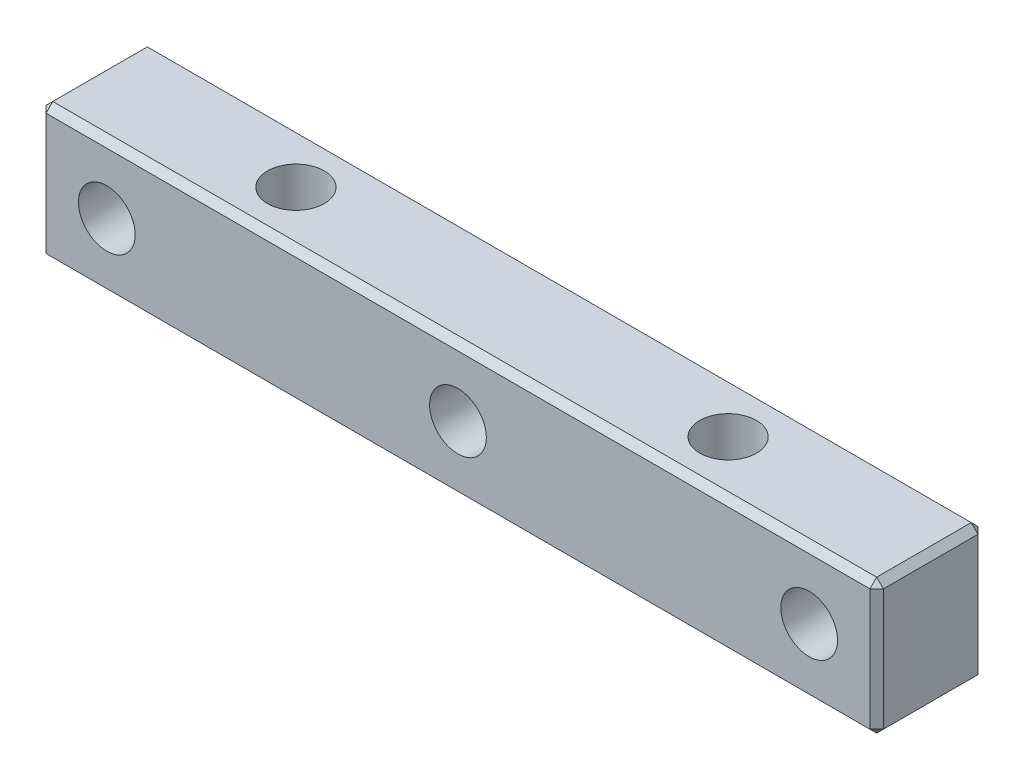
ISO-10303-21;
HEADER;
FILE_DESCRIPTION(('STEP AP214'),'2;1');
FILE_NAME('part.step','',(''),(''),'','','');
FILE_SCHEMA(('AUTOMOTIVE_DESIGN { 1 0 10303 214 1 1 1 1 }'));
ENDSEC;
DATA;
#1=APPLICATION_CONTEXT('core data for automotive mechanical design processes');
#2=APPLICATION_PROTOCOL_DEFINITION('international standard','automotive_design',2000,#1);
#3=PRODUCT_CONTEXT('',#1,'mechanical');
#4=PRODUCT('Part','Part','',(#3));
#5=PRODUCT_RELATED_PRODUCT_CATEGORY('part','',(#4));
#6=PRODUCT_DEFINITION_FORMATION('','',#4);
#7=PRODUCT_DEFINITION_CONTEXT('part definition',#1,'design');
#8=PRODUCT_DEFINITION('design','',#6,#7);
#9=PRODUCT_DEFINITION_SHAPE('','',#8);
#10=(LENGTH_UNIT() NAMED_UNIT(*) SI_UNIT(.MILLI.,.METRE.));
#11=(NAMED_UNIT(*) PLANE_ANGLE_UNIT() SI_UNIT($,.RADIAN.));
#12=(NAMED_UNIT(*) SI_UNIT($,.STERADIAN.) SOLID_ANGLE_UNIT());
#13=UNCERTAINTY_MEASURE_WITH_UNIT(LENGTH_MEASURE(1.E-05),#10,'distance_accuracy_value','');
#14=(GEOMETRIC_REPRESENTATION_CONTEXT(3) GLOBAL_UNCERTAINTY_ASSIGNED_CONTEXT((#13)) GLOBAL_UNIT_ASSIGNED_CONTEXT((#10,
#11,#12)) REPRESENTATION_CONTEXT('',''));
#15=CARTESIAN_POINT('',(0.,0.,0.));
#16=DIRECTION('',(0.,0.,1.));
#17=DIRECTION('',(1.,0.,0.));
#18=AXIS2_PLACEMENT_3D('',#15,#16,#17);
#19=CARTESIAN_POINT('',(0.,0.,4.));
#20=DIRECTION('',(0.,0.,-1.));
#21=DIRECTION('',(-1.,0.,0.));
#22=AXIS2_PLACEMENT_3D('',#19,#20,#21);
#23=PLANE('',#22);
#24=DIRECTION('',(-1.,0.,0.));
#25=VECTOR('',#24,1.);
#26=CARTESIAN_POINT('',(0.,4.5,4.));
#27=LINE('',#26,#25);
#28=CARTESIAN_POINT('',(30.5,4.5,4.));
#29=VERTEX_POINT('',#28);
#30=CARTESIAN_POINT('',(-30.5,4.5,4.));
#31=VERTEX_POINT('',#30);
#32=EDGE_CURVE('E176',#29,#31,#27,.T.);
#33=ORIENTED_EDGE('',*,*,#32,.T.);
#34=DIRECTION('',(0.,-1.,0.));
#35=VECTOR('',#34,1.);
#36=CARTESIAN_POINT('',(-30.5,0.,4.));
#37=LINE('',#36,#35);
#38=CARTESIAN_POINT('',(-30.5,-4.50000000000002,4.));
#39=VERTEX_POINT('',#38);
#40=EDGE_CURVE('E182',#31,#39,#37,.T.);
#41=ORIENTED_EDGE('',*,*,#40,.T.);
#42=DIRECTION('',(1.,0.,0.));
#43=VECTOR('',#42,1.);
#44=CARTESIAN_POINT('',(0.,-4.50000000000001,4.));
#45=LINE('',#44,#43);
#46=CARTESIAN_POINT('',(30.5,-4.50000000000001,4.));
#47=VERTEX_POINT('',#46);
#48=EDGE_CURVE('E180',#39,#47,#45,.T.);
#49=ORIENTED_EDGE('',*,*,#48,.T.);
#50=DIRECTION('',(0.,1.,0.));
#51=VECTOR('',#50,1.);
#52=CARTESIAN_POINT('',(30.5,0.,4.));
#53=LINE('',#52,#51);
#54=EDGE_CURVE('E178',#47,#29,#53,.T.);
#55=ORIENTED_EDGE('',*,*,#54,.T.);
#56=EDGE_LOOP('',(#33,#41,#49,#55));
#57=FACE_BOUND('',#56,.T.);
#58=CARTESIAN_POINT('',(0.,0.,4.));
#59=DIRECTION('',(0.,0.,1.));
#60=DIRECTION('',(1.,0.,0.));
#61=AXIS2_PLACEMENT_3D('',#58,#59,#60);
#62=CIRCLE('',#61,2.1);
#63=CARTESIAN_POINT('',(2.1,0.,4.));
#64=VERTEX_POINT('',#63);
#65=EDGE_CURVE('E281',#64,#64,#62,.T.);
#66=ORIENTED_EDGE('',*,*,#65,.F.);
#67=EDGE_LOOP('',(#66));
#68=FACE_BOUND('',#67,.T.);
#69=CARTESIAN_POINT('',(-26.,0.,4.));
#70=DIRECTION('',(0.,0.,1.));
#71=DIRECTION('',(1.,0.,0.));
#72=AXIS2_PLACEMENT_3D('',#69,#70,#71);
#73=CIRCLE('',#72,2.1);
#74=CARTESIAN_POINT('',(-23.9,0.,4.));
#75=VERTEX_POINT('',#74);
#76=EDGE_CURVE('E287',#75,#75,#73,.T.);
#77=ORIENTED_EDGE('',*,*,#76,.F.);
#78=EDGE_LOOP('',(#77));
#79=FACE_BOUND('',#78,.T.);
#80=CARTESIAN_POINT('',(26.,0.,4.));
#81=DIRECTION('',(0.,0.,1.));
#82=DIRECTION('',(1.,0.,0.));
#83=AXIS2_PLACEMENT_3D('',#80,#81,#82);
#84=CIRCLE('',#83,2.1);
#85=CARTESIAN_POINT('',(28.1,0.,4.));
#86=VERTEX_POINT('',#85);
#87=EDGE_CURVE('E293',#86,#86,#84,.T.);
#88=ORIENTED_EDGE('',*,*,#87,.F.);
#89=EDGE_LOOP('',(#88));
#90=FACE_BOUND('',#89,.T.);
#91=ADVANCED_FACE('F38',(#57,#68,#79,#90),#23,.F.);
#92=CARTESIAN_POINT('',(0.,0.,-4.));
#93=DIRECTION('',(0.,0.,-1.));
#94=DIRECTION('',(-1.,0.,0.));
#95=AXIS2_PLACEMENT_3D('',#92,#93,#94);
#96=PLANE('',#95);
#97=DIRECTION('',(-1.,0.,0.));
#98=VECTOR('',#97,1.);
#99=CARTESIAN_POINT('',(-31.,-4.50000000000001,-4.));
#100=LINE('',#99,#98);
#101=CARTESIAN_POINT('',(30.5,-4.5,-4.));
#102=VERTEX_POINT('',#101);
#103=CARTESIAN_POINT('',(-30.5,-4.50000000000001,-4.));
#104=VERTEX_POINT('',#103);
#105=EDGE_CURVE('E198',#102,#104,#100,.T.);
#106=ORIENTED_EDGE('',*,*,#105,.T.);
#107=DIRECTION('',(0.,1.,0.));
#108=VECTOR('',#107,1.);
#109=CARTESIAN_POINT('',(-30.5,4.99999999999999,-4.));
#110=LINE('',#109,#108);
#111=CARTESIAN_POINT('',(-30.5,4.5,-4.));
#112=VERTEX_POINT('',#111);
#113=EDGE_CURVE('E200',#104,#112,#110,.T.);
#114=ORIENTED_EDGE('',*,*,#113,.T.);
#115=DIRECTION('',(1.,0.,0.));
#116=VECTOR('',#115,1.);
#117=CARTESIAN_POINT('',(31.,4.5,-4.));
#118=LINE('',#117,#116);
#119=CARTESIAN_POINT('',(30.5,4.5,-4.));
#120=VERTEX_POINT('',#119);
#121=EDGE_CURVE('E194',#112,#120,#118,.T.);
#122=ORIENTED_EDGE('',*,*,#121,.T.);
#123=DIRECTION('',(0.,-1.,0.));
#124=VECTOR('',#123,1.);
#125=CARTESIAN_POINT('',(30.5,-5.,-4.));
#126=LINE('',#125,#124);
#127=EDGE_CURVE('E196',#120,#102,#126,.T.);
#128=ORIENTED_EDGE('',*,*,#127,.T.);
#129=EDGE_LOOP('',(#106,#114,#122,#128));
#130=FACE_BOUND('',#129,.T.);
#131=CARTESIAN_POINT('',(0.,0.,-4.));
#132=DIRECTION('',(0.,0.,1.));
#133=DIRECTION('',(1.,0.,0.));
#134=AXIS2_PLACEMENT_3D('',#131,#132,#133);
#135=CIRCLE('',#134,2.1);
#136=CARTESIAN_POINT('',(2.1,0.,-4.));
#137=VERTEX_POINT('',#136);
#138=EDGE_CURVE('E284',#137,#137,#135,.T.);
#139=ORIENTED_EDGE('',*,*,#138,.T.);
#140=EDGE_LOOP('',(#139));
#141=FACE_BOUND('',#140,.T.);
#142=CARTESIAN_POINT('',(-26.,0.,-4.));
#143=DIRECTION('',(0.,0.,1.));
#144=DIRECTION('',(1.,0.,0.));
#145=AXIS2_PLACEMENT_3D('',#142,#143,#144);
#146=CIRCLE('',#145,2.1);
#147=CARTESIAN_POINT('',(-23.9,0.,-4.));
#148=VERTEX_POINT('',#147);
#149=EDGE_CURVE('E290',#148,#148,#146,.T.);
#150=ORIENTED_EDGE('',*,*,#149,.T.);
#151=EDGE_LOOP('',(#150));
#152=FACE_BOUND('',#151,.T.);
#153=CARTESIAN_POINT('',(26.,0.,-4.));
#154=DIRECTION('',(0.,0.,1.));
#155=DIRECTION('',(1.,0.,0.));
#156=AXIS2_PLACEMENT_3D('',#153,#154,#155);
#157=CIRCLE('',#156,2.1);
#158=CARTESIAN_POINT('',(28.1,0.,-4.));
#159=VERTEX_POINT('',#158);
#160=EDGE_CURVE('E159',#159,#159,#157,.T.);
#161=ORIENTED_EDGE('',*,*,#160,.T.);
#162=EDGE_LOOP('',(#161));
#163=FACE_BOUND('',#162,.T.);
#164=ADVANCED_FACE('F330',(#130,#141,#152,#163),#96,.T.);
#165=CARTESIAN_POINT('',(-31.,4.99999999999999,4.));
#166=DIRECTION('',(0.,-1.,0.));
#167=DIRECTION('',(0.,0.,-1.));
#168=AXIS2_PLACEMENT_3D('',#165,#166,#167);
#169=PLANE('',#168);
#170=DIRECTION('',(-1.,0.,0.));
#171=VECTOR('',#170,1.);
#172=CARTESIAN_POINT('',(-31.,4.99999999999999,-3.5));
#173=LINE('',#172,#171);
#174=CARTESIAN_POINT('',(30.5,4.99999999999999,-3.5));
#175=VERTEX_POINT('',#174);
#176=CARTESIAN_POINT('',(-30.5,4.99999999999999,-3.5));
#177=VERTEX_POINT('',#176);
#178=EDGE_CURVE('E173',#175,#177,#173,.T.);
#179=ORIENTED_EDGE('',*,*,#178,.T.);
#180=DIRECTION('',(0.,0.,1.));
#181=VECTOR('',#180,1.);
#182=CARTESIAN_POINT('',(-30.5,4.99999999999999,4.));
#183=LINE('',#182,#181);
#184=CARTESIAN_POINT('',(-30.5,4.99999999999999,3.5));
#185=VERTEX_POINT('',#184);
#186=EDGE_CURVE('E136',#177,#185,#183,.T.);
#187=ORIENTED_EDGE('',*,*,#186,.T.);
#188=DIRECTION('',(1.,0.,0.));
#189=VECTOR('',#188,1.);
#190=CARTESIAN_POINT('',(-31.,4.99999999999999,3.5));
#191=LINE('',#190,#189);
#192=CARTESIAN_POINT('',(30.5,4.99999999999999,3.5));
#193=VERTEX_POINT('',#192);
#194=EDGE_CURVE('E165',#185,#193,#191,.T.);
#195=ORIENTED_EDGE('',*,*,#194,.T.);
#196=DIRECTION('',(0.,0.,-1.));
#197=VECTOR('',#196,1.);
#198=CARTESIAN_POINT('',(30.5,4.99999999999999,4.));
#199=LINE('',#198,#197);
#200=EDGE_CURVE('E167',#193,#175,#199,.T.);
#201=ORIENTED_EDGE('',*,*,#200,.T.);
#202=EDGE_LOOP('',(#179,#187,#195,#201));
#203=FACE_BOUND('',#202,.T.);
#204=CARTESIAN_POINT('',(16.,4.99999999999999,0.));
#205=DIRECTION('',(0.,1.,0.));
#206=DIRECTION('',(0.,0.,1.));
#207=AXIS2_PLACEMENT_3D('',#204,#205,#206);
#208=CIRCLE('',#207,2.1);
#209=CARTESIAN_POINT('',(16.,4.99999999999999,2.1));
#210=VERTEX_POINT('',#209);
#211=EDGE_CURVE('E262',#210,#210,#208,.T.);
#212=ORIENTED_EDGE('',*,*,#211,.F.);
#213=EDGE_LOOP('',(#212));
#214=FACE_BOUND('',#213,.T.);
#215=CARTESIAN_POINT('',(-16.,4.99999999999999,0.));
#216=DIRECTION('',(0.,1.,0.));
#217=DIRECTION('',(0.,0.,1.));
#218=AXIS2_PLACEMENT_3D('',#215,#216,#217);
#219=CIRCLE('',#218,2.1);
#220=CARTESIAN_POINT('',(-16.,4.99999999999999,2.1));
#221=VERTEX_POINT('',#220);
#222=EDGE_CURVE('E273',#221,#221,#219,.T.);
#223=ORIENTED_EDGE('',*,*,#222,.F.);
#224=EDGE_LOOP('',(#223));
#225=FACE_BOUND('',#224,.T.);
#226=ADVANCED_FACE('F321',(#203,#214,#225),#169,.F.);
#227=CARTESIAN_POINT('',(-31.,4.99999999999999,4.));
#228=DIRECTION('',(1.,0.,0.));
#229=DIRECTION('',(0.,0.,-1.));
#230=AXIS2_PLACEMENT_3D('',#227,#228,#229);
#231=PLANE('',#230);
#232=DIRECTION('',(0.,1.,0.));
#233=VECTOR('',#232,1.);
#234=CARTESIAN_POINT('',(-31.,4.99999999999999,3.5));
#235=LINE('',#234,#233);
#236=CARTESIAN_POINT('',(-31.,-4.50000000000001,3.5));
#237=VERTEX_POINT('',#236);
#238=CARTESIAN_POINT('',(-31.,4.5,3.5));
#239=VERTEX_POINT('',#238);
#240=EDGE_CURVE('E163',#237,#239,#235,.T.);
#241=ORIENTED_EDGE('',*,*,#240,.T.);
#242=DIRECTION('',(0.,0.,-1.));
#243=VECTOR('',#242,1.);
#244=CARTESIAN_POINT('',(-31.,4.5,4.));
#245=LINE('',#244,#243);
#246=CARTESIAN_POINT('',(-31.,4.5,-3.50000000000001));
#247=VERTEX_POINT('',#246);
#248=EDGE_CURVE('E134',#239,#247,#245,.T.);
#249=ORIENTED_EDGE('',*,*,#248,.T.);
#250=DIRECTION('',(0.,-1.,0.));
#251=VECTOR('',#250,1.);
#252=CARTESIAN_POINT('',(-31.,-5.00000000000001,-3.50000000000001));
#253=LINE('',#252,#251);
#254=CARTESIAN_POINT('',(-31.,-4.50000000000001,-3.50000000000001));
#255=VERTEX_POINT('',#254);
#256=EDGE_CURVE('E152',#247,#255,#253,.T.);
#257=ORIENTED_EDGE('',*,*,#256,.T.);
#258=DIRECTION('',(0.,0.,1.));
#259=VECTOR('',#258,1.);
#260=CARTESIAN_POINT('',(-31.,-4.50000000000001,4.));
#261=LINE('',#260,#259);
#262=EDGE_CURVE('E158',#255,#237,#261,.T.);
#263=ORIENTED_EDGE('',*,*,#262,.T.);
#264=EDGE_LOOP('',(#241,#249,#257,#263));
#265=FACE_BOUND('',#264,.T.);
#266=ADVANCED_FACE('F161',(#265),#231,.F.);
#267=CARTESIAN_POINT('',(31.,-5.,4.));
#268=DIRECTION('',(0.,1.,0.));
#269=DIRECTION('',(-1.,0.,0.));
#270=AXIS2_PLACEMENT_3D('',#267,#268,#269);
#271=PLANE('',#270);
#272=DIRECTION('',(0.,0.,1.));
#273=VECTOR('',#272,1.);
#274=CARTESIAN_POINT('',(30.5,-5.,4.));
#275=LINE('',#274,#273);
#276=CARTESIAN_POINT('',(30.5,-5.,-3.50000000000001));
#277=VERTEX_POINT('',#276);
#278=CARTESIAN_POINT('',(30.5,-5.,3.5));
#279=VERTEX_POINT('',#278);
#280=EDGE_CURVE('E187',#277,#279,#275,.T.);
#281=ORIENTED_EDGE('',*,*,#280,.T.);
#282=DIRECTION('',(-1.,0.,0.));
#283=VECTOR('',#282,1.);
#284=CARTESIAN_POINT('',(31.,-5.,3.5));
#285=LINE('',#284,#283);
#286=CARTESIAN_POINT('',(-30.5,-5.00000000000001,3.5));
#287=VERTEX_POINT('',#286);
#288=EDGE_CURVE('E192',#279,#287,#285,.T.);
#289=ORIENTED_EDGE('',*,*,#288,.T.);
#290=DIRECTION('',(0.,0.,-1.));
#291=VECTOR('',#290,1.);
#292=CARTESIAN_POINT('',(-30.5,-5.00000000000001,4.));
#293=LINE('',#292,#291);
#294=CARTESIAN_POINT('',(-30.5,-5.00000000000001,-3.50000000000001));
#295=VERTEX_POINT('',#294);
#296=EDGE_CURVE('E189',#287,#295,#293,.T.);
#297=ORIENTED_EDGE('',*,*,#296,.T.);
#298=DIRECTION('',(1.,0.,0.));
#299=VECTOR('',#298,1.);
#300=CARTESIAN_POINT('',(31.,-5.,-3.50000000000001));
#301=LINE('',#300,#299);
#302=EDGE_CURVE('E185',#295,#277,#301,.T.);
#303=ORIENTED_EDGE('',*,*,#302,.T.);
#304=EDGE_LOOP('',(#281,#289,#297,#303));
#305=FACE_BOUND('',#304,.T.);
#306=CARTESIAN_POINT('',(16.,-5.00000000000001,0.));
#307=DIRECTION('',(0.,1.,0.));
#308=DIRECTION('',(0.,0.,1.));
#309=AXIS2_PLACEMENT_3D('',#306,#307,#308);
#310=CIRCLE('',#309,2.1);
#311=CARTESIAN_POINT('',(16.,-5.00000000000001,2.1));
#312=VERTEX_POINT('',#311);
#313=EDGE_CURVE('E268',#312,#312,#310,.T.);
#314=ORIENTED_EDGE('',*,*,#313,.T.);
#315=EDGE_LOOP('',(#314));
#316=FACE_BOUND('',#315,.T.);
#317=CARTESIAN_POINT('',(-16.,-5.00000000000001,0.));
#318=DIRECTION('',(0.,1.,0.));
#319=DIRECTION('',(0.,0.,1.));
#320=AXIS2_PLACEMENT_3D('',#317,#318,#319);
#321=CIRCLE('',#320,2.1);
#322=CARTESIAN_POINT('',(-16.,-5.00000000000001,2.1));
#323=VERTEX_POINT('',#322);
#324=EDGE_CURVE('E278',#323,#323,#321,.T.);
#325=ORIENTED_EDGE('',*,*,#324,.T.);
#326=EDGE_LOOP('',(#325));
#327=FACE_BOUND('',#326,.T.);
#328=ADVANCED_FACE('F365',(#305,#316,#327),#271,.F.);
#329=CARTESIAN_POINT('',(31.,4.99999999999999,4.));
#330=DIRECTION('',(-1.,0.,0.));
#331=DIRECTION('',(0.,0.,1.));
#332=AXIS2_PLACEMENT_3D('',#329,#330,#331);
#333=PLANE('',#332);
#334=DIRECTION('',(0.,-1.,0.));
#335=VECTOR('',#334,1.);
#336=CARTESIAN_POINT('',(31.,4.99999999999999,3.5));
#337=LINE('',#336,#335);
#338=CARTESIAN_POINT('',(31.,4.5,3.5));
#339=VERTEX_POINT('',#338);
#340=CARTESIAN_POINT('',(31.,-4.50000000000001,3.5));
#341=VERTEX_POINT('',#340);
#342=EDGE_CURVE('E47',#339,#341,#337,.T.);
#343=ORIENTED_EDGE('',*,*,#342,.T.);
#344=DIRECTION('',(0.,0.,-1.));
#345=VECTOR('',#344,1.);
#346=CARTESIAN_POINT('',(31.,-4.50000000000001,4.));
#347=LINE('',#346,#345);
#348=CARTESIAN_POINT('',(31.,-4.50000000000001,-3.50000000000001));
#349=VERTEX_POINT('',#348);
#350=EDGE_CURVE('E11',#341,#349,#347,.T.);
#351=ORIENTED_EDGE('',*,*,#350,.T.);
#352=DIRECTION('',(0.,1.,0.));
#353=VECTOR('',#352,1.);
#354=CARTESIAN_POINT('',(31.,4.99999999999999,-3.50000000000001));
#355=LINE('',#354,#353);
#356=CARTESIAN_POINT('',(31.,4.5,-3.50000000000001));
#357=VERTEX_POINT('',#356);
#358=EDGE_CURVE('E61',#349,#357,#355,.T.);
#359=ORIENTED_EDGE('',*,*,#358,.T.);
#360=DIRECTION('',(0.,0.,1.));
#361=VECTOR('',#360,1.);
#362=CARTESIAN_POINT('',(31.,4.5,4.));
#363=LINE('',#362,#361);
#364=EDGE_CURVE('E203',#357,#339,#363,.T.);
#365=ORIENTED_EDGE('',*,*,#364,.T.);
#366=EDGE_LOOP('',(#343,#351,#359,#365));
#367=FACE_BOUND('',#366,.T.);
#368=ADVANCED_FACE('F362',(#367),#333,.F.);
#369=CARTESIAN_POINT('',(26.,0.,4.));
#370=DIRECTION('',(0.,0.,1.));
#371=DIRECTION('',(1.,0.,0.));
#372=AXIS2_PLACEMENT_3D('',#369,#370,#371);
#373=CYLINDRICAL_SURFACE('',#372,2.1);
#374=ORIENTED_EDGE('',*,*,#160,.F.);
#375=EDGE_LOOP('',(#374));
#376=FACE_BOUND('',#375,.T.);
#377=ORIENTED_EDGE('',*,*,#87,.T.);
#378=EDGE_LOOP('',(#377));
#379=FACE_BOUND('',#378,.T.);
#380=ADVANCED_FACE('F359',(#376,#379),#373,.F.);
#381=CARTESIAN_POINT('',(-26.,0.,4.));
#382=DIRECTION('',(0.,0.,1.));
#383=DIRECTION('',(1.,0.,0.));
#384=AXIS2_PLACEMENT_3D('',#381,#382,#383);
#385=CYLINDRICAL_SURFACE('',#384,2.1);
#386=ORIENTED_EDGE('',*,*,#149,.F.);
#387=EDGE_LOOP('',(#386));
#388=FACE_BOUND('',#387,.T.);
#389=ORIENTED_EDGE('',*,*,#76,.T.);
#390=EDGE_LOOP('',(#389));
#391=FACE_BOUND('',#390,.T.);
#392=ADVANCED_FACE('F550',(#388,#391),#385,.F.);
#393=CARTESIAN_POINT('',(0.,0.,4.));
#394=DIRECTION('',(0.,0.,1.));
#395=DIRECTION('',(1.,0.,0.));
#396=AXIS2_PLACEMENT_3D('',#393,#394,#395);
#397=CYLINDRICAL_SURFACE('',#396,2.1);
#398=ORIENTED_EDGE('',*,*,#138,.F.);
#399=EDGE_LOOP('',(#398));
#400=FACE_BOUND('',#399,.T.);
#401=ORIENTED_EDGE('',*,*,#65,.T.);
#402=EDGE_LOOP('',(#401));
#403=FACE_BOUND('',#402,.T.);
#404=ADVANCED_FACE('F540',(#400,#403),#397,.F.);
#405=CARTESIAN_POINT('',(-16.,4.99999999999999,0.));
#406=DIRECTION('',(0.,1.,0.));
#407=DIRECTION('',(0.,0.,1.));
#408=AXIS2_PLACEMENT_3D('',#405,#406,#407);
#409=CYLINDRICAL_SURFACE('',#408,2.1);
#410=ORIENTED_EDGE('',*,*,#324,.F.);
#411=EDGE_LOOP('',(#410));
#412=FACE_BOUND('',#411,.T.);
#413=ORIENTED_EDGE('',*,*,#222,.T.);
#414=EDGE_LOOP('',(#413));
#415=FACE_BOUND('',#414,.T.);
#416=ADVANCED_FACE('F530',(#412,#415),#409,.F.);
#417=CARTESIAN_POINT('',(16.,4.99999999999999,0.));
#418=DIRECTION('',(0.,1.,0.));
#419=DIRECTION('',(0.,0.,1.));
#420=AXIS2_PLACEMENT_3D('',#417,#418,#419);
#421=CYLINDRICAL_SURFACE('',#420,2.1);
#422=ORIENTED_EDGE('',*,*,#313,.F.);
#423=EDGE_LOOP('',(#422));
#424=FACE_BOUND('',#423,.T.);
#425=ORIENTED_EDGE('',*,*,#211,.T.);
#426=EDGE_LOOP('',(#425));
#427=FACE_BOUND('',#426,.T.);
#428=ADVANCED_FACE('F521',(#424,#427),#421,.F.);
#429=CARTESIAN_POINT('',(31.,-4.50000000000001,4.));
#430=DIRECTION('',(-0.707106781186543,0.707106781186552,0.));
#431=DIRECTION('',(0.,0.,-1.));
#432=AXIS2_PLACEMENT_3D('',#429,#430,#431);
#433=PLANE('',#432);
#434=DIRECTION('',(-0.707106781186552,-0.707106781186543,0.));
#435=VECTOR('',#434,1.);
#436=CARTESIAN_POINT('',(30.5,-5.,3.5));
#437=LINE('',#436,#435);
#438=EDGE_CURVE('E42',#279,#341,#437,.F.);
#439=ORIENTED_EDGE('',*,*,#438,.F.);
#440=ORIENTED_EDGE('',*,*,#280,.F.);
#441=DIRECTION('',(0.707106781186552,0.707106781186543,0.));
#442=VECTOR('',#441,1.);
#443=CARTESIAN_POINT('',(31.,-4.50000000000001,-3.50000000000001));
#444=LINE('',#443,#442);
#445=EDGE_CURVE('E256',#349,#277,#444,.F.);
#446=ORIENTED_EDGE('',*,*,#445,.F.);
#447=ORIENTED_EDGE('',*,*,#350,.F.);
#448=EDGE_LOOP('',(#439,#440,#446,#447));
#449=FACE_BOUND('',#448,.T.);
#450=ADVANCED_FACE('F40',(#449),#433,.F.);
#451=CARTESIAN_POINT('',(30.5,-5.,3.5));
#452=DIRECTION('',(0.577350269189626,-0.577350269189634,0.577350269189617));
#453=DIRECTION('',(0.707106781186552,0.707106781186542,0.));
#454=AXIS2_PLACEMENT_3D('',#451,#452,#453);
#455=PLANE('',#454);
#456=DIRECTION('',(0.,0.707106781186542,0.707106781186553));
#457=VECTOR('',#456,1.);
#458=CARTESIAN_POINT('',(30.5,-5.,3.5));
#459=LINE('',#458,#457);
#460=EDGE_CURVE('E251',#279,#47,#459,.T.);
#461=ORIENTED_EDGE('',*,*,#460,.F.);
#462=ORIENTED_EDGE('',*,*,#438,.T.);
#463=DIRECTION('',(0.707106781186543,0.,-0.707106781186552));
#464=VECTOR('',#463,1.);
#465=CARTESIAN_POINT('',(30.75,-4.50000000000001,3.75));
#466=LINE('',#465,#464);
#467=EDGE_CURVE('E254',#47,#341,#466,.T.);
#468=ORIENTED_EDGE('',*,*,#467,.F.);
#469=EDGE_LOOP('',(#461,#462,#468));
#470=FACE_BOUND('',#469,.T.);
#471=ADVANCED_FACE('F507',(#470),#455,.T.);
#472=CARTESIAN_POINT('',(31.,-4.50000000000001,-3.50000000000001));
#473=DIRECTION('',(0.577350269189618,-0.577350269189626,-0.577350269189633));
#474=DIRECTION('',(0.,0.707106781186552,-0.707106781186543));
#475=AXIS2_PLACEMENT_3D('',#472,#473,#474);
#476=PLANE('',#475);
#477=DIRECTION('',(0.707106781186552,0.,0.707106781186543));
#478=VECTOR('',#477,1.);
#479=CARTESIAN_POINT('',(31.,-4.50000000000001,-3.50000000000001));
#480=LINE('',#479,#478);
#481=EDGE_CURVE('E246',#349,#102,#480,.F.);
#482=ORIENTED_EDGE('',*,*,#481,.F.);
#483=ORIENTED_EDGE('',*,*,#445,.T.);
#484=DIRECTION('',(0.,0.707106781186552,-0.707106781186544));
#485=VECTOR('',#484,1.);
#486=CARTESIAN_POINT('',(30.5,-4.75,-3.75));
#487=LINE('',#486,#485);
#488=EDGE_CURVE('E248',#102,#277,#487,.F.);
#489=ORIENTED_EDGE('',*,*,#488,.F.);
#490=EDGE_LOOP('',(#482,#483,#489));
#491=FACE_BOUND('',#490,.T.);
#492=ADVANCED_FACE('F498',(#491),#476,.T.);
#493=CARTESIAN_POINT('',(30.5,0.,4.));
#494=DIRECTION('',(-0.707106781186552,0.,-0.707106781186543));
#495=DIRECTION('',(0.,1.,0.));
#496=AXIS2_PLACEMENT_3D('',#493,#494,#495);
#497=PLANE('',#496);
#498=ORIENTED_EDGE('',*,*,#467,.T.);
#499=ORIENTED_EDGE('',*,*,#342,.F.);
#500=DIRECTION('',(-0.707106781186543,0.,0.707106781186552));
#501=VECTOR('',#500,1.);
#502=CARTESIAN_POINT('',(30.5,4.5,4.));
#503=LINE('',#502,#501);
#504=EDGE_CURVE('E240',#29,#339,#503,.F.);
#505=ORIENTED_EDGE('',*,*,#504,.F.);
#506=ORIENTED_EDGE('',*,*,#54,.F.);
#507=EDGE_LOOP('',(#498,#499,#505,#506));
#508=FACE_BOUND('',#507,.T.);
#509=ADVANCED_FACE('F489',(#508),#497,.F.);
#510=CARTESIAN_POINT('',(0.,-4.50000000000001,4.));
#511=DIRECTION('',(0.,0.707106781186553,-0.707106781186542));
#512=DIRECTION('',(1.,0.,0.));
#513=AXIS2_PLACEMENT_3D('',#510,#511,#512);
#514=PLANE('',#513);
#515=ORIENTED_EDGE('',*,*,#460,.T.);
#516=ORIENTED_EDGE('',*,*,#48,.F.);
#517=DIRECTION('',(0.,-0.707106781186542,-0.707106781186553));
#518=VECTOR('',#517,1.);
#519=CARTESIAN_POINT('',(-30.5,-4.50000000000002,4.));
#520=LINE('',#519,#518);
#521=EDGE_CURVE('E237',#287,#39,#520,.F.);
#522=ORIENTED_EDGE('',*,*,#521,.F.);
#523=ORIENTED_EDGE('',*,*,#288,.F.);
#524=EDGE_LOOP('',(#515,#516,#522,#523));
#525=FACE_BOUND('',#524,.T.);
#526=ADVANCED_FACE('F481',(#525),#514,.F.);
#527=CARTESIAN_POINT('',(-30.5,-5.00000000000001,4.));
#528=DIRECTION('',(0.707106781186552,0.707106781186543,0.));
#529=DIRECTION('',(0.,0.,-1.));
#530=AXIS2_PLACEMENT_3D('',#527,#528,#529);
#531=PLANE('',#530);
#532=DIRECTION('',(0.707106781186543,-0.707106781186552,0.));
#533=VECTOR('',#532,1.);
#534=CARTESIAN_POINT('',(-30.5,-5.00000000000001,-3.50000000000001));
#535=LINE('',#534,#533);
#536=EDGE_CURVE('E231',#295,#255,#535,.F.);
#537=ORIENTED_EDGE('',*,*,#536,.F.);
#538=ORIENTED_EDGE('',*,*,#296,.F.);
#539=DIRECTION('',(-0.707106781186543,0.707106781186552,0.));
#540=VECTOR('',#539,1.);
#541=CARTESIAN_POINT('',(-30.75,-4.75000000000001,3.5));
#542=LINE('',#541,#540);
#543=EDGE_CURVE('E234',#237,#287,#542,.F.);
#544=ORIENTED_EDGE('',*,*,#543,.F.);
#545=ORIENTED_EDGE('',*,*,#262,.F.);
#546=EDGE_LOOP('',(#537,#538,#544,#545));
#547=FACE_BOUND('',#546,.T.);
#548=ADVANCED_FACE('F302',(#547),#531,.F.);
#549=CARTESIAN_POINT('',(31.,-5.,-3.50000000000001));
#550=DIRECTION('',(0.,-0.707106781186544,-0.707106781186552));
#551=DIRECTION('',(-1.,0.,0.));
#552=AXIS2_PLACEMENT_3D('',#549,#550,#551);
#553=PLANE('',#552);
#554=ORIENTED_EDGE('',*,*,#488,.T.);
#555=ORIENTED_EDGE('',*,*,#302,.F.);
#556=DIRECTION('',(0.,-0.707106781186551,0.707106781186544));
#557=VECTOR('',#556,1.);
#558=CARTESIAN_POINT('',(-30.5,-5.00000000000001,-3.50000000000001));
#559=LINE('',#558,#557);
#560=EDGE_CURVE('E229',#104,#295,#559,.T.);
#561=ORIENTED_EDGE('',*,*,#560,.F.);
#562=ORIENTED_EDGE('',*,*,#105,.F.);
#563=EDGE_LOOP('',(#554,#555,#561,#562));
#564=FACE_BOUND('',#563,.T.);
#565=ADVANCED_FACE('F336',(#564),#553,.T.);
#566=CARTESIAN_POINT('',(31.,4.99999999999999,-3.50000000000001));
#567=DIRECTION('',(0.707106781186543,0.,-0.707106781186552));
#568=DIRECTION('',(0.,-1.,0.));
#569=AXIS2_PLACEMENT_3D('',#566,#567,#568);
#570=PLANE('',#569);
#571=ORIENTED_EDGE('',*,*,#481,.T.);
#572=ORIENTED_EDGE('',*,*,#127,.F.);
#573=DIRECTION('',(-0.707106781186552,0.,-0.707106781186543));
#574=VECTOR('',#573,1.);
#575=CARTESIAN_POINT('',(31.,4.5,-3.50000000000001));
#576=LINE('',#575,#574);
#577=EDGE_CURVE('E226',#357,#120,#576,.T.);
#578=ORIENTED_EDGE('',*,*,#577,.F.);
#579=ORIENTED_EDGE('',*,*,#358,.F.);
#580=EDGE_LOOP('',(#571,#572,#578,#579));
#581=FACE_BOUND('',#580,.T.);
#582=ADVANCED_FACE('F458',(#581),#570,.T.);
#583=CARTESIAN_POINT('',(30.5,4.99999999999999,4.));
#584=DIRECTION('',(-0.707106781186543,-0.707106781186552,0.));
#585=DIRECTION('',(0.,0.,-1.));
#586=AXIS2_PLACEMENT_3D('',#583,#584,#585);
#587=PLANE('',#586);
#588=DIRECTION('',(0.707106781186552,-0.707106781186543,0.));
#589=VECTOR('',#588,1.);
#590=CARTESIAN_POINT('',(30.75,4.75,3.5));
#591=LINE('',#590,#589);
#592=EDGE_CURVE('E243',#339,#193,#591,.F.);
#593=ORIENTED_EDGE('',*,*,#592,.F.);
#594=ORIENTED_EDGE('',*,*,#364,.F.);
#595=DIRECTION('',(-0.707106781186552,0.707106781186543,0.));
#596=VECTOR('',#595,1.);
#597=CARTESIAN_POINT('',(31.,4.5,-3.50000000000001));
#598=LINE('',#597,#596);
#599=EDGE_CURVE('E223',#175,#357,#598,.F.);
#600=ORIENTED_EDGE('',*,*,#599,.F.);
#601=ORIENTED_EDGE('',*,*,#200,.F.);
#602=EDGE_LOOP('',(#593,#594,#600,#601));
#603=FACE_BOUND('',#602,.T.);
#604=ADVANCED_FACE('F449',(#603),#587,.F.);
#605=CARTESIAN_POINT('',(30.5,4.5,4.));
#606=DIRECTION('',(0.577350269189626,0.577350269189634,0.577350269189618));
#607=DIRECTION('',(-0.707106781186552,0.707106781186543,0.));
#608=AXIS2_PLACEMENT_3D('',#605,#606,#607);
#609=PLANE('',#608);
#610=ORIENTED_EDGE('',*,*,#504,.T.);
#611=ORIENTED_EDGE('',*,*,#592,.T.);
#612=DIRECTION('',(0.,0.707106781186543,-0.707106781186552));
#613=VECTOR('',#612,1.);
#614=CARTESIAN_POINT('',(30.5,4.5,4.));
#615=LINE('',#614,#613);
#616=EDGE_CURVE('E220',#29,#193,#615,.T.);
#617=ORIENTED_EDGE('',*,*,#616,.F.);
#618=EDGE_LOOP('',(#610,#611,#617));
#619=FACE_BOUND('',#618,.T.);
#620=ADVANCED_FACE('F348',(#619),#609,.T.);
#621=CARTESIAN_POINT('',(-30.5,-4.50000000000002,4.));
#622=DIRECTION('',(-0.577350269189634,-0.577350269189626,0.577350269189617));
#623=DIRECTION('',(0.707106781186543,-0.707106781186552,0.));
#624=AXIS2_PLACEMENT_3D('',#621,#622,#623);
#625=PLANE('',#624);
#626=ORIENTED_EDGE('',*,*,#543,.T.);
#627=ORIENTED_EDGE('',*,*,#521,.T.);
#628=DIRECTION('',(0.707106781186543,0.,0.707106781186552));
#629=VECTOR('',#628,1.);
#630=CARTESIAN_POINT('',(-30.5,-4.50000000000002,4.));
#631=LINE('',#630,#629);
#632=EDGE_CURVE('E218',#237,#39,#631,.T.);
#633=ORIENTED_EDGE('',*,*,#632,.F.);
#634=EDGE_LOOP('',(#626,#627,#633));
#635=FACE_BOUND('',#634,.T.);
#636=ADVANCED_FACE('F305',(#635),#625,.T.);
#637=CARTESIAN_POINT('',(-30.5,-5.00000000000001,-3.50000000000001));
#638=DIRECTION('',(-0.577350269189625,-0.577350269189618,-0.577350269189634));
#639=DIRECTION('',(-0.707106781186552,0.,0.707106781186543));
#640=AXIS2_PLACEMENT_3D('',#637,#638,#639);
#641=PLANE('',#640);
#642=ORIENTED_EDGE('',*,*,#560,.T.);
#643=ORIENTED_EDGE('',*,*,#536,.T.);
#644=DIRECTION('',(0.707106781186552,0.,-0.707106781186543));
#645=VECTOR('',#644,1.);
#646=CARTESIAN_POINT('',(-30.75,-4.50000000000001,-3.75));
#647=LINE('',#646,#645);
#648=EDGE_CURVE('E155',#104,#255,#647,.F.);
#649=ORIENTED_EDGE('',*,*,#648,.F.);
#650=EDGE_LOOP('',(#642,#643,#649));
#651=FACE_BOUND('',#650,.T.);
#652=ADVANCED_FACE('F338',(#651),#641,.T.);
#653=CARTESIAN_POINT('',(31.,4.5,-3.50000000000001));
#654=DIRECTION('',(0.577350269189618,0.577350269189634,-0.577350269189626));
#655=DIRECTION('',(0.,0.707106781186543,0.707106781186552));
#656=AXIS2_PLACEMENT_3D('',#653,#654,#655);
#657=PLANE('',#656);
#658=ORIENTED_EDGE('',*,*,#599,.T.);
#659=ORIENTED_EDGE('',*,*,#577,.T.);
#660=DIRECTION('',(0.,0.707106781186543,0.707106781186552));
#661=VECTOR('',#660,1.);
#662=CARTESIAN_POINT('',(30.5,4.75,-3.75));
#663=LINE('',#662,#661);
#664=EDGE_CURVE('E214',#175,#120,#663,.F.);
#665=ORIENTED_EDGE('',*,*,#664,.F.);
#666=EDGE_LOOP('',(#658,#659,#665));
#667=FACE_BOUND('',#666,.T.);
#668=ADVANCED_FACE('F340',(#667),#657,.T.);
#669=CARTESIAN_POINT('',(0.,4.5,4.));
#670=DIRECTION('',(0.,-0.707106781186552,-0.707106781186543));
#671=DIRECTION('',(-1.,0.,0.));
#672=AXIS2_PLACEMENT_3D('',#669,#670,#671);
#673=PLANE('',#672);
#674=ORIENTED_EDGE('',*,*,#616,.T.);
#675=ORIENTED_EDGE('',*,*,#194,.F.);
#676=DIRECTION('',(0.,-0.707106781186543,0.707106781186552));
#677=VECTOR('',#676,1.);
#678=CARTESIAN_POINT('',(-30.5,4.99999999999999,3.5));
#679=LINE('',#678,#677);
#680=EDGE_CURVE('E211',#31,#185,#679,.F.);
#681=ORIENTED_EDGE('',*,*,#680,.F.);
#682=ORIENTED_EDGE('',*,*,#32,.F.);
#683=EDGE_LOOP('',(#674,#675,#681,#682));
#684=FACE_BOUND('',#683,.T.);
#685=ADVANCED_FACE('F317',(#684),#673,.F.);
#686=CARTESIAN_POINT('',(-30.5,0.,4.));
#687=DIRECTION('',(0.707106781186552,0.,-0.707106781186543));
#688=DIRECTION('',(0.,-1.,0.));
#689=AXIS2_PLACEMENT_3D('',#686,#687,#688);
#690=PLANE('',#689);
#691=ORIENTED_EDGE('',*,*,#632,.T.);
#692=ORIENTED_EDGE('',*,*,#40,.F.);
#693=DIRECTION('',(-0.707106781186543,0.,-0.707106781186552));
#694=VECTOR('',#693,1.);
#695=CARTESIAN_POINT('',(-30.75,4.5,3.75));
#696=LINE('',#695,#694);
#697=EDGE_CURVE('E149',#239,#31,#696,.F.);
#698=ORIENTED_EDGE('',*,*,#697,.F.);
#699=ORIENTED_EDGE('',*,*,#240,.F.);
#700=EDGE_LOOP('',(#691,#692,#698,#699));
#701=FACE_BOUND('',#700,.T.);
#702=ADVANCED_FACE('F309',(#701),#690,.F.);
#703=CARTESIAN_POINT('',(-31.,4.99999999999999,-3.50000000000001));
#704=DIRECTION('',(-0.707106781186543,0.,-0.707106781186552));
#705=DIRECTION('',(0.,1.,0.));
#706=AXIS2_PLACEMENT_3D('',#703,#704,#705);
#707=PLANE('',#706);
#708=ORIENTED_EDGE('',*,*,#648,.T.);
#709=ORIENTED_EDGE('',*,*,#256,.F.);
#710=DIRECTION('',(-0.707106781186552,0.,0.707106781186543));
#711=VECTOR('',#710,1.);
#712=CARTESIAN_POINT('',(-31.,4.5,-3.50000000000001));
#713=LINE('',#712,#711);
#714=EDGE_CURVE('E141',#112,#247,#713,.T.);
#715=ORIENTED_EDGE('',*,*,#714,.F.);
#716=ORIENTED_EDGE('',*,*,#113,.F.);
#717=EDGE_LOOP('',(#708,#709,#715,#716));
#718=FACE_BOUND('',#717,.T.);
#719=ADVANCED_FACE('F153',(#718),#707,.T.);
#720=CARTESIAN_POINT('',(-31.,4.99999999999999,-3.5));
#721=DIRECTION('',(0.,0.707106781186552,-0.707106781186543));
#722=DIRECTION('',(1.,0.,0.));
#723=AXIS2_PLACEMENT_3D('',#720,#721,#722);
#724=PLANE('',#723);
#725=ORIENTED_EDGE('',*,*,#664,.T.);
#726=ORIENTED_EDGE('',*,*,#121,.F.);
#727=DIRECTION('',(0.,-0.707106781186543,-0.707106781186552));
#728=VECTOR('',#727,1.);
#729=CARTESIAN_POINT('',(-30.5,4.75,-3.75));
#730=LINE('',#729,#728);
#731=EDGE_CURVE('E145',#177,#112,#730,.T.);
#732=ORIENTED_EDGE('',*,*,#731,.F.);
#733=ORIENTED_EDGE('',*,*,#178,.F.);
#734=EDGE_LOOP('',(#725,#726,#732,#733));
#735=FACE_BOUND('',#734,.T.);
#736=ADVANCED_FACE('F326',(#735),#724,.T.);
#737=CARTESIAN_POINT('',(-30.5,4.99999999999999,3.5));
#738=DIRECTION('',(-0.577350269189626,0.577350269189634,0.577350269189618));
#739=DIRECTION('',(-0.707106781186552,-0.707106781186543,0.));
#740=AXIS2_PLACEMENT_3D('',#737,#738,#739);
#741=PLANE('',#740);
#742=ORIENTED_EDGE('',*,*,#697,.T.);
#743=ORIENTED_EDGE('',*,*,#680,.T.);
#744=DIRECTION('',(0.707106781186552,0.707106781186543,0.));
#745=VECTOR('',#744,1.);
#746=CARTESIAN_POINT('',(-30.5,4.99999999999999,3.5));
#747=LINE('',#746,#745);
#748=EDGE_CURVE('E138',#239,#185,#747,.T.);
#749=ORIENTED_EDGE('',*,*,#748,.F.);
#750=EDGE_LOOP('',(#742,#743,#749));
#751=FACE_BOUND('',#750,.T.);
#752=ADVANCED_FACE('F313',(#751),#741,.T.);
#753=CARTESIAN_POINT('',(-31.,4.5,-3.50000000000001));
#754=DIRECTION('',(-0.577350269189618,0.577350269189634,-0.577350269189626));
#755=DIRECTION('',(0.,0.707106781186543,0.707106781186552));
#756=AXIS2_PLACEMENT_3D('',#753,#754,#755);
#757=PLANE('',#756);
#758=ORIENTED_EDGE('',*,*,#731,.T.);
#759=ORIENTED_EDGE('',*,*,#714,.T.);
#760=DIRECTION('',(-0.707106781186552,-0.707106781186543,0.));
#761=VECTOR('',#760,1.);
#762=CARTESIAN_POINT('',(-31.,4.5,-3.50000000000001));
#763=LINE('',#762,#761);
#764=EDGE_CURVE('E130',#177,#247,#763,.T.);
#765=ORIENTED_EDGE('',*,*,#764,.F.);
#766=EDGE_LOOP('',(#758,#759,#765));
#767=FACE_BOUND('',#766,.T.);
#768=ADVANCED_FACE('F143',(#767),#757,.T.);
#769=CARTESIAN_POINT('',(-31.,4.5,4.));
#770=DIRECTION('',(0.707106781186543,-0.707106781186552,0.));
#771=DIRECTION('',(0.,0.,-1.));
#772=AXIS2_PLACEMENT_3D('',#769,#770,#771);
#773=PLANE('',#772);
#774=ORIENTED_EDGE('',*,*,#748,.T.);
#775=ORIENTED_EDGE('',*,*,#186,.F.);
#776=ORIENTED_EDGE('',*,*,#764,.T.);
#777=ORIENTED_EDGE('',*,*,#248,.F.);
#778=EDGE_LOOP('',(#774,#775,#776,#777));
#779=FACE_BOUND('',#778,.T.);
#780=ADVANCED_FACE('F132',(#779),#773,.F.);
#781=CLOSED_SHELL('',(#91,#164,#226,#266,#328,#368,#380,#392,#404,#416,#428,#450,#471,#492,#509,
#526,#548,#565,#582,#604,#620,#636,#652,#668,#685,#702,#719,#736,#752,#768,#780));
#782=MANIFOLD_SOLID_BREP('B2',#781);
#783=ADVANCED_BREP_SHAPE_REPRESENTATION('',(#18,#782),#14);
#784=SHAPE_DEFINITION_REPRESENTATION(#9,#783);
ENDSEC;
END-ISO-10303-21;
